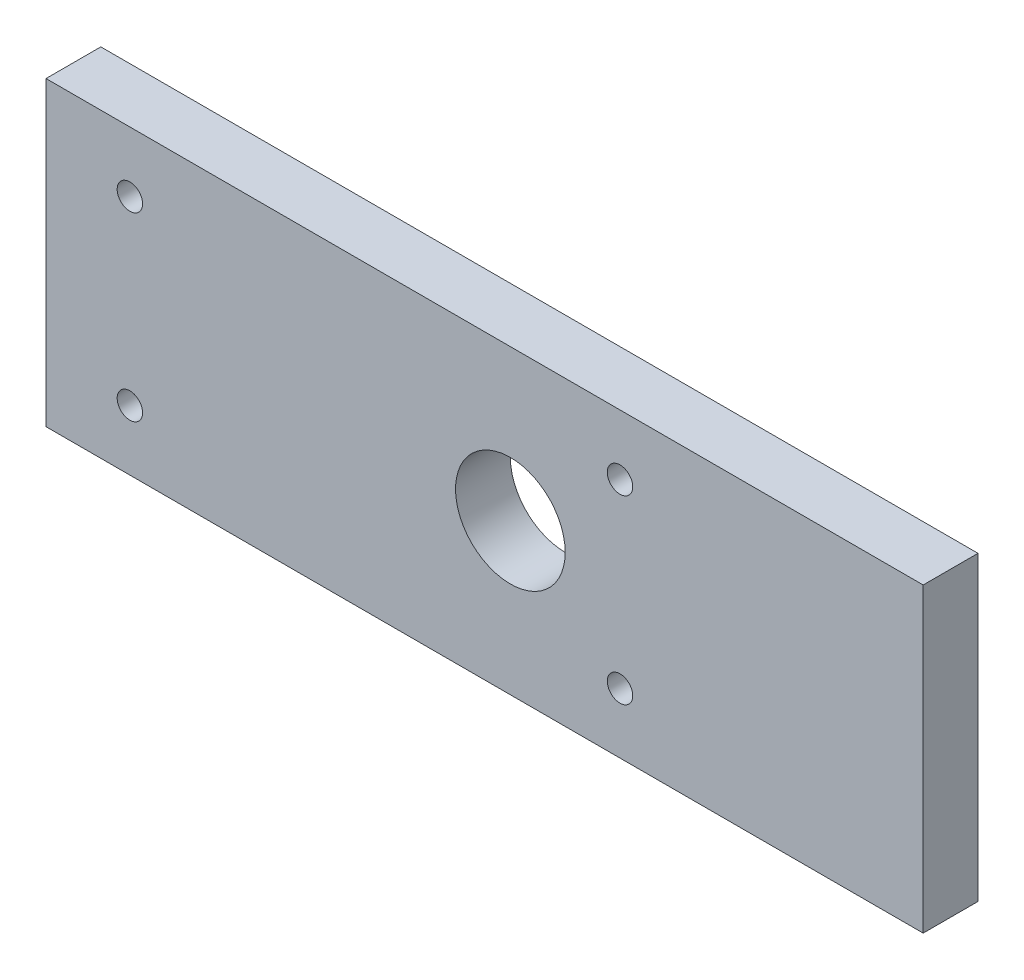
ISO-10303-21;
HEADER;
FILE_DESCRIPTION(('STEP AP214'),'2;1');
FILE_NAME('part.step','',(''),(''),'','','');
FILE_SCHEMA(('AUTOMOTIVE_DESIGN { 1 0 10303 214 1 1 1 1 }'));
ENDSEC;
DATA;
#1=APPLICATION_CONTEXT('core data for automotive mechanical design processes');
#2=APPLICATION_PROTOCOL_DEFINITION('international standard','automotive_design',2000,#1);
#3=PRODUCT_CONTEXT('',#1,'mechanical');
#4=PRODUCT('Part','Part','',(#3));
#5=PRODUCT_RELATED_PRODUCT_CATEGORY('part','',(#4));
#6=PRODUCT_DEFINITION_FORMATION('','',#4);
#7=PRODUCT_DEFINITION_CONTEXT('part definition',#1,'design');
#8=PRODUCT_DEFINITION('design','',#6,#7);
#9=PRODUCT_DEFINITION_SHAPE('','',#8);
#10=(LENGTH_UNIT() NAMED_UNIT(*) SI_UNIT(.MILLI.,.METRE.));
#11=(NAMED_UNIT(*) PLANE_ANGLE_UNIT() SI_UNIT($,.RADIAN.));
#12=(NAMED_UNIT(*) SI_UNIT($,.STERADIAN.) SOLID_ANGLE_UNIT());
#13=UNCERTAINTY_MEASURE_WITH_UNIT(LENGTH_MEASURE(1.E-05),#10,'distance_accuracy_value','');
#14=(GEOMETRIC_REPRESENTATION_CONTEXT(3) GLOBAL_UNCERTAINTY_ASSIGNED_CONTEXT((#13)) GLOBAL_UNIT_ASSIGNED_CONTEXT((#10,
#11,#12)) REPRESENTATION_CONTEXT('',''));
#15=CARTESIAN_POINT('',(0.,0.,0.));
#16=DIRECTION('',(0.,0.,1.));
#17=DIRECTION('',(1.,0.,0.));
#18=AXIS2_PLACEMENT_3D('',#15,#16,#17);
#19=CARTESIAN_POINT('',(63.5,-17.4625,6.35));
#20=DIRECTION('',(-1.,0.,0.));
#21=DIRECTION('',(0.,0.,1.));
#22=AXIS2_PLACEMENT_3D('',#19,#20,#21);
#23=PLANE('',#22);
#24=DIRECTION('',(0.,1.,0.));
#25=VECTOR('',#24,1.);
#26=CARTESIAN_POINT('',(63.5,-17.4625,0.));
#27=LINE('',#26,#25);
#28=CARTESIAN_POINT('',(63.5,-17.4625,0.));
#29=VERTEX_POINT('',#28);
#30=CARTESIAN_POINT('',(63.5,17.4625,0.));
#31=VERTEX_POINT('',#30);
#32=EDGE_CURVE('E96',#29,#31,#27,.T.);
#33=ORIENTED_EDGE('',*,*,#32,.T.);
#34=DIRECTION('',(0.,0.,-1.));
#35=VECTOR('',#34,1.);
#36=CARTESIAN_POINT('',(63.5,17.4625,6.35));
#37=LINE('',#36,#35);
#38=CARTESIAN_POINT('',(63.5,17.4625,6.35));
#39=VERTEX_POINT('',#38);
#40=EDGE_CURVE('E11',#39,#31,#37,.T.);
#41=ORIENTED_EDGE('',*,*,#40,.F.);
#42=DIRECTION('',(0.,1.,0.));
#43=VECTOR('',#42,1.);
#44=CARTESIAN_POINT('',(63.5,-17.4625,6.35));
#45=LINE('',#44,#43);
#46=CARTESIAN_POINT('',(63.5,-17.4625,6.35));
#47=VERTEX_POINT('',#46);
#48=EDGE_CURVE('E84',#47,#39,#45,.T.);
#49=ORIENTED_EDGE('',*,*,#48,.F.);
#50=DIRECTION('',(0.,0.,-1.));
#51=VECTOR('',#50,1.);
#52=CARTESIAN_POINT('',(63.5,-17.4625,6.35));
#53=LINE('',#52,#51);
#54=EDGE_CURVE('E92',#47,#29,#53,.T.);
#55=ORIENTED_EDGE('',*,*,#54,.T.);
#56=EDGE_LOOP('',(#33,#41,#49,#55));
#57=FACE_BOUND('',#56,.T.);
#58=ADVANCED_FACE('F33',(#57),#23,.F.);
#59=CARTESIAN_POINT('',(-38.1,17.4625,6.35));
#60=DIRECTION('',(0.,-1.,0.));
#61=DIRECTION('',(0.,0.,-1.));
#62=AXIS2_PLACEMENT_3D('',#59,#60,#61);
#63=PLANE('',#62);
#64=DIRECTION('',(-1.,0.,0.));
#65=VECTOR('',#64,1.);
#66=CARTESIAN_POINT('',(-38.1,17.4625,0.));
#67=LINE('',#66,#65);
#68=CARTESIAN_POINT('',(-38.1,17.4625,0.));
#69=VERTEX_POINT('',#68);
#70=EDGE_CURVE('E88',#31,#69,#67,.T.);
#71=ORIENTED_EDGE('',*,*,#70,.T.);
#72=DIRECTION('',(0.,0.,-1.));
#73=VECTOR('',#72,1.);
#74=CARTESIAN_POINT('',(-38.1,17.4625,6.35));
#75=LINE('',#74,#73);
#76=CARTESIAN_POINT('',(-38.1,17.4625,6.35));
#77=VERTEX_POINT('',#76);
#78=EDGE_CURVE('E41',#77,#69,#75,.T.);
#79=ORIENTED_EDGE('',*,*,#78,.F.);
#80=DIRECTION('',(-1.,0.,0.));
#81=VECTOR('',#80,1.);
#82=CARTESIAN_POINT('',(-38.1,17.4625,6.35));
#83=LINE('',#82,#81);
#84=EDGE_CURVE('E79',#39,#77,#83,.T.);
#85=ORIENTED_EDGE('',*,*,#84,.F.);
#86=ORIENTED_EDGE('',*,*,#40,.T.);
#87=EDGE_LOOP('',(#71,#79,#85,#86));
#88=FACE_BOUND('',#87,.T.);
#89=ADVANCED_FACE('F87',(#88),#63,.F.);
#90=CARTESIAN_POINT('',(-38.1,-17.4625,6.35));
#91=DIRECTION('',(1.,0.,0.));
#92=DIRECTION('',(0.,0.,-1.));
#93=AXIS2_PLACEMENT_3D('',#90,#91,#92);
#94=PLANE('',#93);
#95=DIRECTION('',(0.,-1.,0.));
#96=VECTOR('',#95,1.);
#97=CARTESIAN_POINT('',(-38.1,-17.4625,0.));
#98=LINE('',#97,#96);
#99=CARTESIAN_POINT('',(-38.1,-17.4625,0.));
#100=VERTEX_POINT('',#99);
#101=EDGE_CURVE('E66',#69,#100,#98,.T.);
#102=ORIENTED_EDGE('',*,*,#101,.T.);
#103=DIRECTION('',(0.,0.,-1.));
#104=VECTOR('',#103,1.);
#105=CARTESIAN_POINT('',(-38.1,-17.4625,6.35));
#106=LINE('',#105,#104);
#107=CARTESIAN_POINT('',(-38.1,-17.4625,6.35));
#108=VERTEX_POINT('',#107);
#109=EDGE_CURVE('E89',#108,#100,#106,.T.);
#110=ORIENTED_EDGE('',*,*,#109,.F.);
#111=DIRECTION('',(0.,-1.,0.));
#112=VECTOR('',#111,1.);
#113=CARTESIAN_POINT('',(-38.1,-17.4625,6.35));
#114=LINE('',#113,#112);
#115=EDGE_CURVE('E82',#77,#108,#114,.T.);
#116=ORIENTED_EDGE('',*,*,#115,.F.);
#117=ORIENTED_EDGE('',*,*,#78,.T.);
#118=EDGE_LOOP('',(#102,#110,#116,#117));
#119=FACE_BOUND('',#118,.T.);
#120=ADVANCED_FACE('F90',(#119),#94,.F.);
#121=CARTESIAN_POINT('',(-38.1,-17.4625,6.35));
#122=DIRECTION('',(0.,1.,0.));
#123=DIRECTION('',(0.,0.,1.));
#124=AXIS2_PLACEMENT_3D('',#121,#122,#123);
#125=PLANE('',#124);
#126=DIRECTION('',(1.,0.,0.));
#127=VECTOR('',#126,1.);
#128=CARTESIAN_POINT('',(-38.1,-17.4625,0.));
#129=LINE('',#128,#127);
#130=EDGE_CURVE('E72',#100,#29,#129,.T.);
#131=ORIENTED_EDGE('',*,*,#130,.T.);
#132=ORIENTED_EDGE('',*,*,#54,.F.);
#133=DIRECTION('',(1.,0.,0.));
#134=VECTOR('',#133,1.);
#135=CARTESIAN_POINT('',(-38.1,-17.4625,6.35));
#136=LINE('',#135,#134);
#137=EDGE_CURVE('E49',#108,#47,#136,.T.);
#138=ORIENTED_EDGE('',*,*,#137,.F.);
#139=ORIENTED_EDGE('',*,*,#109,.T.);
#140=EDGE_LOOP('',(#131,#132,#138,#139));
#141=FACE_BOUND('',#140,.T.);
#142=ADVANCED_FACE('F104',(#141),#125,.F.);
#143=CARTESIAN_POINT('',(0.,0.,6.35));
#144=DIRECTION('',(0.,0.,-1.));
#145=DIRECTION('',(-1.,0.,0.));
#146=AXIS2_PLACEMENT_3D('',#143,#144,#145);
#147=PLANE('',#146);
#148=CARTESIAN_POINT('',(15.6845,0.,6.35));
#149=DIRECTION('',(0.,0.,1.));
#150=DIRECTION('',(1.,0.,0.));
#151=AXIS2_PLACEMENT_3D('',#148,#149,#150);
#152=CIRCLE('',#151,6.35);
#153=CARTESIAN_POINT('',(22.0345,0.,6.35));
#154=VERTEX_POINT('',#153);
#155=EDGE_CURVE('E133',#154,#154,#152,.T.);
#156=ORIENTED_EDGE('',*,*,#155,.F.);
#157=EDGE_LOOP('',(#156));
#158=FACE_BOUND('',#157,.T.);
#159=CARTESIAN_POINT('',(-28.3845,10.4775,6.35));
#160=DIRECTION('',(0.,0.,1.));
#161=DIRECTION('',(1.,0.,0.));
#162=AXIS2_PLACEMENT_3D('',#159,#160,#161);
#163=CIRCLE('',#162,1.4732);
#164=CARTESIAN_POINT('',(-26.9113,10.4775,6.35));
#165=VERTEX_POINT('',#164);
#166=EDGE_CURVE('E127',#165,#165,#163,.T.);
#167=ORIENTED_EDGE('',*,*,#166,.F.);
#168=EDGE_LOOP('',(#167));
#169=FACE_BOUND('',#168,.T.);
#170=CARTESIAN_POINT('',(-28.3845,-10.4775,6.35));
#171=DIRECTION('',(0.,0.,1.));
#172=DIRECTION('',(1.,0.,0.));
#173=AXIS2_PLACEMENT_3D('',#170,#171,#172);
#174=CIRCLE('',#173,1.4732);
#175=CARTESIAN_POINT('',(-26.9113,-10.4775,6.35));
#176=VERTEX_POINT('',#175);
#177=EDGE_CURVE('E121',#176,#176,#174,.T.);
#178=ORIENTED_EDGE('',*,*,#177,.F.);
#179=EDGE_LOOP('',(#178));
#180=FACE_BOUND('',#179,.T.);
#181=CARTESIAN_POINT('',(28.3845,-10.4775,6.35));
#182=DIRECTION('',(0.,0.,1.));
#183=DIRECTION('',(1.,0.,0.));
#184=AXIS2_PLACEMENT_3D('',#181,#182,#183);
#185=CIRCLE('',#184,1.4732);
#186=CARTESIAN_POINT('',(29.8577,-10.4775,6.35));
#187=VERTEX_POINT('',#186);
#188=EDGE_CURVE('E115',#187,#187,#185,.T.);
#189=ORIENTED_EDGE('',*,*,#188,.F.);
#190=EDGE_LOOP('',(#189));
#191=FACE_BOUND('',#190,.T.);
#192=CARTESIAN_POINT('',(28.3845,10.4775,6.35));
#193=DIRECTION('',(0.,0.,1.));
#194=DIRECTION('',(1.,0.,0.));
#195=AXIS2_PLACEMENT_3D('',#192,#193,#194);
#196=CIRCLE('',#195,1.4732);
#197=CARTESIAN_POINT('',(29.8577,10.4775,6.35));
#198=VERTEX_POINT('',#197);
#199=EDGE_CURVE('E99',#198,#198,#196,.T.);
#200=ORIENTED_EDGE('',*,*,#199,.F.);
#201=EDGE_LOOP('',(#200));
#202=FACE_BOUND('',#201,.T.);
#203=ORIENTED_EDGE('',*,*,#48,.T.);
#204=ORIENTED_EDGE('',*,*,#84,.T.);
#205=ORIENTED_EDGE('',*,*,#115,.T.);
#206=ORIENTED_EDGE('',*,*,#137,.T.);
#207=EDGE_LOOP('',(#203,#204,#205,#206));
#208=FACE_BOUND('',#207,.T.);
#209=ADVANCED_FACE('F80',(#158,#169,#180,#191,#202,#208),#147,.F.);
#210=CARTESIAN_POINT('',(0.,0.,0.));
#211=DIRECTION('',(0.,0.,-1.));
#212=DIRECTION('',(-1.,0.,0.));
#213=AXIS2_PLACEMENT_3D('',#210,#211,#212);
#214=PLANE('',#213);
#215=CARTESIAN_POINT('',(15.6845,0.,0.));
#216=DIRECTION('',(0.,0.,-1.));
#217=DIRECTION('',(-1.,0.,0.));
#218=AXIS2_PLACEMENT_3D('',#215,#216,#217);
#219=CIRCLE('',#218,6.35);
#220=CARTESIAN_POINT('',(9.3345,0.,0.));
#221=VERTEX_POINT('',#220);
#222=EDGE_CURVE('E134',#221,#221,#219,.F.);
#223=ORIENTED_EDGE('',*,*,#222,.T.);
#224=EDGE_LOOP('',(#223));
#225=FACE_BOUND('',#224,.T.);
#226=CARTESIAN_POINT('',(-28.3845,10.4775,0.));
#227=DIRECTION('',(0.,0.,1.));
#228=DIRECTION('',(1.,0.,0.));
#229=AXIS2_PLACEMENT_3D('',#226,#227,#228);
#230=CIRCLE('',#229,1.4732);
#231=CARTESIAN_POINT('',(-26.9113,10.4775,0.));
#232=VERTEX_POINT('',#231);
#233=EDGE_CURVE('E130',#232,#232,#230,.T.);
#234=ORIENTED_EDGE('',*,*,#233,.T.);
#235=EDGE_LOOP('',(#234));
#236=FACE_BOUND('',#235,.T.);
#237=CARTESIAN_POINT('',(-28.3845,-10.4775,0.));
#238=DIRECTION('',(0.,0.,1.));
#239=DIRECTION('',(1.,0.,0.));
#240=AXIS2_PLACEMENT_3D('',#237,#238,#239);
#241=CIRCLE('',#240,1.4732);
#242=CARTESIAN_POINT('',(-26.9113,-10.4775,0.));
#243=VERTEX_POINT('',#242);
#244=EDGE_CURVE('E124',#243,#243,#241,.T.);
#245=ORIENTED_EDGE('',*,*,#244,.T.);
#246=EDGE_LOOP('',(#245));
#247=FACE_BOUND('',#246,.T.);
#248=CARTESIAN_POINT('',(28.3845,-10.4775,0.));
#249=DIRECTION('',(0.,0.,1.));
#250=DIRECTION('',(1.,0.,0.));
#251=AXIS2_PLACEMENT_3D('',#248,#249,#250);
#252=CIRCLE('',#251,1.4732);
#253=CARTESIAN_POINT('',(29.8577,-10.4775,0.));
#254=VERTEX_POINT('',#253);
#255=EDGE_CURVE('E118',#254,#254,#252,.T.);
#256=ORIENTED_EDGE('',*,*,#255,.T.);
#257=EDGE_LOOP('',(#256));
#258=FACE_BOUND('',#257,.T.);
#259=CARTESIAN_POINT('',(28.3845,10.4775,0.));
#260=DIRECTION('',(0.,0.,1.));
#261=DIRECTION('',(1.,0.,0.));
#262=AXIS2_PLACEMENT_3D('',#259,#260,#261);
#263=CIRCLE('',#262,1.4732);
#264=CARTESIAN_POINT('',(29.8577,10.4775,0.));
#265=VERTEX_POINT('',#264);
#266=EDGE_CURVE('E112',#265,#265,#263,.T.);
#267=ORIENTED_EDGE('',*,*,#266,.T.);
#268=EDGE_LOOP('',(#267));
#269=FACE_BOUND('',#268,.T.);
#270=ORIENTED_EDGE('',*,*,#32,.F.);
#271=ORIENTED_EDGE('',*,*,#130,.F.);
#272=ORIENTED_EDGE('',*,*,#101,.F.);
#273=ORIENTED_EDGE('',*,*,#70,.F.);
#274=EDGE_LOOP('',(#270,#271,#272,#273));
#275=FACE_BOUND('',#274,.T.);
#276=ADVANCED_FACE('F107',(#225,#236,#247,#258,#269,#275),#214,.T.);
#277=CARTESIAN_POINT('',(28.3845,10.4775,6.35));
#278=DIRECTION('',(0.,0.,1.));
#279=DIRECTION('',(1.,0.,0.));
#280=AXIS2_PLACEMENT_3D('',#277,#278,#279);
#281=CYLINDRICAL_SURFACE('',#280,1.4732);
#282=ORIENTED_EDGE('',*,*,#266,.F.);
#283=EDGE_LOOP('',(#282));
#284=FACE_BOUND('',#283,.T.);
#285=ORIENTED_EDGE('',*,*,#199,.T.);
#286=EDGE_LOOP('',(#285));
#287=FACE_BOUND('',#286,.T.);
#288=ADVANCED_FACE('F153',(#284,#287),#281,.F.);
#289=CARTESIAN_POINT('',(28.3845,-10.4775,6.35));
#290=DIRECTION('',(0.,0.,1.));
#291=DIRECTION('',(1.,0.,0.));
#292=AXIS2_PLACEMENT_3D('',#289,#290,#291);
#293=CYLINDRICAL_SURFACE('',#292,1.4732);
#294=ORIENTED_EDGE('',*,*,#255,.F.);
#295=EDGE_LOOP('',(#294));
#296=FACE_BOUND('',#295,.T.);
#297=ORIENTED_EDGE('',*,*,#188,.T.);
#298=EDGE_LOOP('',(#297));
#299=FACE_BOUND('',#298,.T.);
#300=ADVANCED_FACE('F155',(#296,#299),#293,.F.);
#301=CARTESIAN_POINT('',(-28.3845,-10.4775,6.35));
#302=DIRECTION('',(0.,0.,1.));
#303=DIRECTION('',(1.,0.,0.));
#304=AXIS2_PLACEMENT_3D('',#301,#302,#303);
#305=CYLINDRICAL_SURFACE('',#304,1.4732);
#306=ORIENTED_EDGE('',*,*,#244,.F.);
#307=EDGE_LOOP('',(#306));
#308=FACE_BOUND('',#307,.T.);
#309=ORIENTED_EDGE('',*,*,#177,.T.);
#310=EDGE_LOOP('',(#309));
#311=FACE_BOUND('',#310,.T.);
#312=ADVANCED_FACE('F162',(#308,#311),#305,.F.);
#313=CARTESIAN_POINT('',(-28.3845,10.4775,6.35));
#314=DIRECTION('',(0.,0.,1.));
#315=DIRECTION('',(1.,0.,0.));
#316=AXIS2_PLACEMENT_3D('',#313,#314,#315);
#317=CYLINDRICAL_SURFACE('',#316,1.4732);
#318=ORIENTED_EDGE('',*,*,#233,.F.);
#319=EDGE_LOOP('',(#318));
#320=FACE_BOUND('',#319,.T.);
#321=ORIENTED_EDGE('',*,*,#166,.T.);
#322=EDGE_LOOP('',(#321));
#323=FACE_BOUND('',#322,.T.);
#324=ADVANCED_FACE('F200',(#320,#323),#317,.F.);
#325=CARTESIAN_POINT('',(15.6845,0.,-0.00100000000000013));
#326=DIRECTION('',(0.,0.,1.));
#327=DIRECTION('',(1.,0.,0.));
#328=AXIS2_PLACEMENT_3D('',#325,#326,#327);
#329=CYLINDRICAL_SURFACE('',#328,6.35);
#330=ORIENTED_EDGE('',*,*,#222,.F.);
#331=EDGE_LOOP('',(#330));
#332=FACE_BOUND('',#331,.T.);
#333=ORIENTED_EDGE('',*,*,#155,.T.);
#334=EDGE_LOOP('',(#333));
#335=FACE_BOUND('',#334,.T.);
#336=ADVANCED_FACE('F140',(#332,#335),#329,.F.);
#337=CLOSED_SHELL('',(#58,#89,#120,#142,#209,#276,#288,#300,#312,#324,#336));
#338=MANIFOLD_SOLID_BREP('B2',#337);
#339=ADVANCED_BREP_SHAPE_REPRESENTATION('',(#18,#338),#14);
#340=SHAPE_DEFINITION_REPRESENTATION(#9,#339);
ENDSEC;
END-ISO-10303-21;
